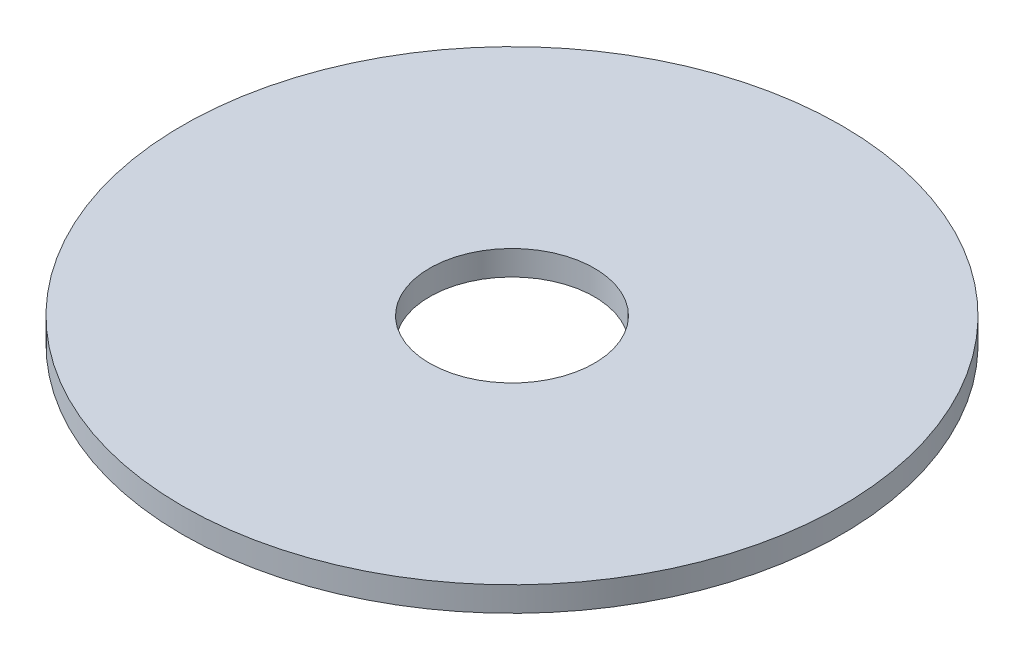
ISO-10303-21;
HEADER;
FILE_DESCRIPTION(('STEP AP214'),'2;1');
FILE_NAME('part.step','',(''),(''),'','','');
FILE_SCHEMA(('AUTOMOTIVE_DESIGN { 1 0 10303 214 1 1 1 1 }'));
ENDSEC;
DATA;
#1=APPLICATION_CONTEXT('core data for automotive mechanical design processes');
#2=APPLICATION_PROTOCOL_DEFINITION('international standard','automotive_design',2000,#1);
#3=PRODUCT_CONTEXT('',#1,'mechanical');
#4=PRODUCT('Part','Part','',(#3));
#5=PRODUCT_RELATED_PRODUCT_CATEGORY('part','',(#4));
#6=PRODUCT_DEFINITION_FORMATION('','',#4);
#7=PRODUCT_DEFINITION_CONTEXT('part definition',#1,'design');
#8=PRODUCT_DEFINITION('design','',#6,#7);
#9=PRODUCT_DEFINITION_SHAPE('','',#8);
#10=(LENGTH_UNIT() NAMED_UNIT(*) SI_UNIT(.MILLI.,.METRE.));
#11=(NAMED_UNIT(*) PLANE_ANGLE_UNIT() SI_UNIT($,.RADIAN.));
#12=(NAMED_UNIT(*) SI_UNIT($,.STERADIAN.) SOLID_ANGLE_UNIT());
#13=UNCERTAINTY_MEASURE_WITH_UNIT(LENGTH_MEASURE(1.E-05),#10,'distance_accuracy_value','');
#14=(GEOMETRIC_REPRESENTATION_CONTEXT(3) GLOBAL_UNCERTAINTY_ASSIGNED_CONTEXT((#13)) GLOBAL_UNIT_ASSIGNED_CONTEXT((#10,
#11,#12)) REPRESENTATION_CONTEXT('',''));
#15=CARTESIAN_POINT('',(0.,0.,0.));
#16=DIRECTION('',(0.,0.,1.));
#17=DIRECTION('',(1.,0.,0.));
#18=AXIS2_PLACEMENT_3D('',#15,#16,#17);
#19=CARTESIAN_POINT('',(0.,1.5,0.));
#20=DIRECTION('',(0.,-1.,0.));
#21=DIRECTION('',(0.,0.,-1.));
#22=AXIS2_PLACEMENT_3D('',#19,#20,#21);
#23=CYLINDRICAL_SURFACE('',#22,20.);
#24=CARTESIAN_POINT('',(0.,1.5,0.));
#25=DIRECTION('',(0.,1.,0.));
#26=DIRECTION('',(0.,0.,1.));
#27=AXIS2_PLACEMENT_3D('',#24,#25,#26);
#28=CIRCLE('',#27,20.);
#29=CARTESIAN_POINT('',(0.,1.5,20.));
#30=VERTEX_POINT('',#29);
#31=EDGE_CURVE('E10',#30,#30,#28,.T.);
#32=ORIENTED_EDGE('',*,*,#31,.F.);
#33=EDGE_LOOP('',(#32));
#34=FACE_BOUND('',#33,.T.);
#35=CARTESIAN_POINT('',(0.,0.,0.));
#36=DIRECTION('',(0.,1.,0.));
#37=DIRECTION('',(0.,0.,1.));
#38=AXIS2_PLACEMENT_3D('',#35,#36,#37);
#39=CIRCLE('',#38,20.);
#40=CARTESIAN_POINT('',(0.,0.,20.));
#41=VERTEX_POINT('',#40);
#42=EDGE_CURVE('E34',#41,#41,#39,.T.);
#43=ORIENTED_EDGE('',*,*,#42,.T.);
#44=EDGE_LOOP('',(#43));
#45=FACE_BOUND('',#44,.T.);
#46=ADVANCED_FACE('F31',(#34,#45),#23,.T.);
#47=CARTESIAN_POINT('',(0.,1.5,0.));
#48=DIRECTION('',(0.,1.,0.));
#49=DIRECTION('',(0.,0.,1.));
#50=AXIS2_PLACEMENT_3D('',#47,#48,#49);
#51=PLANE('',#50);
#52=CARTESIAN_POINT('',(0.,1.5,0.));
#53=DIRECTION('',(0.,1.,0.));
#54=DIRECTION('',(0.,0.,1.));
#55=AXIS2_PLACEMENT_3D('',#52,#53,#54);
#56=CIRCLE('',#55,4.99999999999989);
#57=CARTESIAN_POINT('',(0.,1.5,4.99999999999989));
#58=VERTEX_POINT('',#57);
#59=EDGE_CURVE('E43',#58,#58,#56,.T.);
#60=ORIENTED_EDGE('',*,*,#59,.F.);
#61=EDGE_LOOP('',(#60));
#62=FACE_BOUND('',#61,.T.);
#63=ORIENTED_EDGE('',*,*,#31,.T.);
#64=EDGE_LOOP('',(#63));
#65=FACE_BOUND('',#64,.T.);
#66=ADVANCED_FACE('F58',(#62,#65),#51,.T.);
#67=CARTESIAN_POINT('',(0.,0.,0.));
#68=DIRECTION('',(0.,1.,0.));
#69=DIRECTION('',(0.,0.,1.));
#70=AXIS2_PLACEMENT_3D('',#67,#68,#69);
#71=PLANE('',#70);
#72=CARTESIAN_POINT('',(0.,0.,0.));
#73=DIRECTION('',(0.,1.,0.));
#74=DIRECTION('',(0.,0.,1.));
#75=AXIS2_PLACEMENT_3D('',#72,#73,#74);
#76=CIRCLE('',#75,4.99999999999989);
#77=CARTESIAN_POINT('',(0.,0.,4.99999999999989));
#78=VERTEX_POINT('',#77);
#79=EDGE_CURVE('E41',#78,#78,#76,.T.);
#80=ORIENTED_EDGE('',*,*,#79,.T.);
#81=EDGE_LOOP('',(#80));
#82=FACE_BOUND('',#81,.T.);
#83=ORIENTED_EDGE('',*,*,#42,.F.);
#84=EDGE_LOOP('',(#83));
#85=FACE_BOUND('',#84,.T.);
#86=ADVANCED_FACE('F49',(#82,#85),#71,.F.);
#87=CARTESIAN_POINT('',(0.,0.,0.));
#88=DIRECTION('',(0.,1.,0.));
#89=DIRECTION('',(0.,0.,1.));
#90=AXIS2_PLACEMENT_3D('',#87,#88,#89);
#91=CYLINDRICAL_SURFACE('',#90,4.99999999999989);
#92=ORIENTED_EDGE('',*,*,#79,.F.);
#93=EDGE_LOOP('',(#92));
#94=FACE_BOUND('',#93,.T.);
#95=ORIENTED_EDGE('',*,*,#59,.T.);
#96=EDGE_LOOP('',(#95));
#97=FACE_BOUND('',#96,.T.);
#98=ADVANCED_FACE('F52',(#94,#97),#91,.F.);
#99=CLOSED_SHELL('',(#46,#66,#86,#98));
#100=MANIFOLD_SOLID_BREP('B2',#99);
#101=ADVANCED_BREP_SHAPE_REPRESENTATION('',(#18,#100),#14);
#102=SHAPE_DEFINITION_REPRESENTATION(#9,#101);
ENDSEC;
END-ISO-10303-21;
